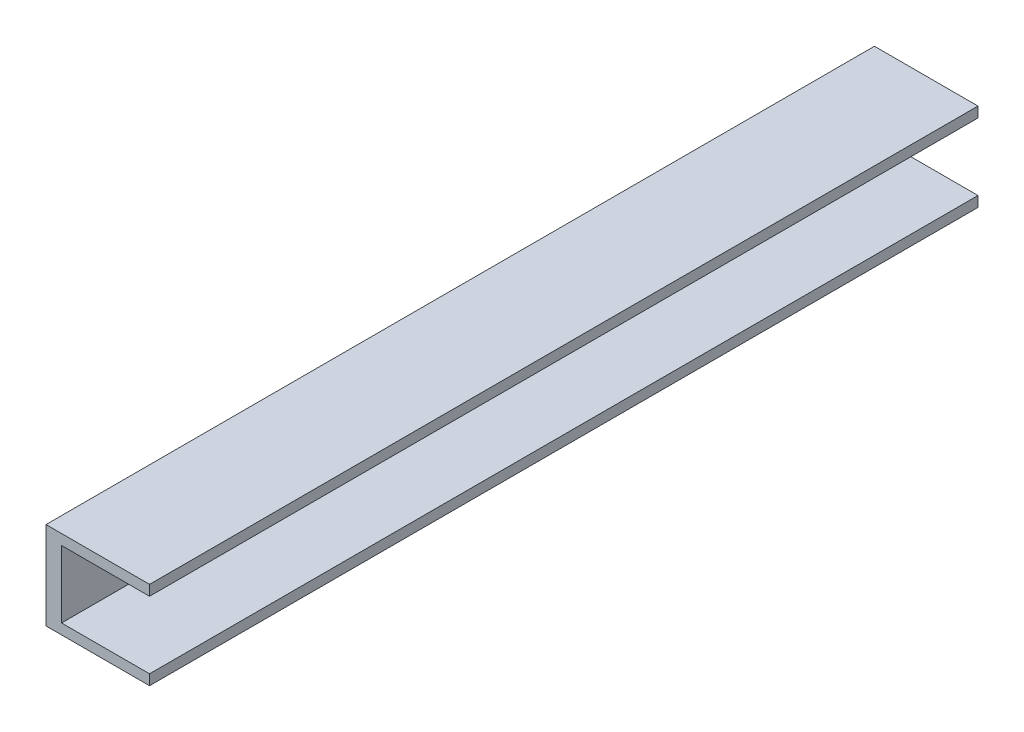
ISO-10303-21;
HEADER;
FILE_DESCRIPTION(('STEP AP214'),'2;1');
FILE_NAME('part.step','',(''),(''),'','','');
FILE_SCHEMA(('AUTOMOTIVE_DESIGN { 1 0 10303 214 1 1 1 1 }'));
ENDSEC;
DATA;
#1=APPLICATION_CONTEXT('core data for automotive mechanical design processes');
#2=APPLICATION_PROTOCOL_DEFINITION('international standard','automotive_design',2000,#1);
#3=PRODUCT_CONTEXT('',#1,'mechanical');
#4=PRODUCT('Part','Part','',(#3));
#5=PRODUCT_RELATED_PRODUCT_CATEGORY('part','',(#4));
#6=PRODUCT_DEFINITION_FORMATION('','',#4);
#7=PRODUCT_DEFINITION_CONTEXT('part definition',#1,'design');
#8=PRODUCT_DEFINITION('design','',#6,#7);
#9=PRODUCT_DEFINITION_SHAPE('','',#8);
#10=(LENGTH_UNIT() NAMED_UNIT(*) SI_UNIT(.MILLI.,.METRE.));
#11=(NAMED_UNIT(*) PLANE_ANGLE_UNIT() SI_UNIT($,.RADIAN.));
#12=(NAMED_UNIT(*) SI_UNIT($,.STERADIAN.) SOLID_ANGLE_UNIT());
#13=UNCERTAINTY_MEASURE_WITH_UNIT(LENGTH_MEASURE(1.E-05),#10,'distance_accuracy_value','');
#14=(GEOMETRIC_REPRESENTATION_CONTEXT(3) GLOBAL_UNCERTAINTY_ASSIGNED_CONTEXT((#13)) GLOBAL_UNIT_ASSIGNED_CONTEXT((#10,
#11,#12)) REPRESENTATION_CONTEXT('',''));
#15=CARTESIAN_POINT('',(0.,0.,0.));
#16=DIRECTION('',(0.,0.,1.));
#17=DIRECTION('',(1.,0.,0.));
#18=AXIS2_PLACEMENT_3D('',#15,#16,#17);
#19=CARTESIAN_POINT('',(31.75,0.,127.));
#20=DIRECTION('',(0.,1.,0.));
#21=DIRECTION('',(-1.,0.,0.));
#22=AXIS2_PLACEMENT_3D('',#19,#20,#21);
#23=PLANE('',#22);
#24=DIRECTION('',(1.,0.,0.));
#25=VECTOR('',#24,1.);
#26=CARTESIAN_POINT('',(31.75,0.,-127.));
#27=LINE('',#26,#25);
#28=CARTESIAN_POINT('',(0.,0.,-127.));
#29=VERTEX_POINT('',#28);
#30=CARTESIAN_POINT('',(31.75,0.,-127.));
#31=VERTEX_POINT('',#30);
#32=EDGE_CURVE('E140',#29,#31,#27,.T.);
#33=ORIENTED_EDGE('',*,*,#32,.T.);
#34=DIRECTION('',(0.,0.,-1.));
#35=VECTOR('',#34,1.);
#36=CARTESIAN_POINT('',(31.75,0.,127.));
#37=LINE('',#36,#35);
#38=CARTESIAN_POINT('',(31.75,0.,127.));
#39=VERTEX_POINT('',#38);
#40=EDGE_CURVE('E11',#39,#31,#37,.T.);
#41=ORIENTED_EDGE('',*,*,#40,.F.);
#42=DIRECTION('',(1.,0.,0.));
#43=VECTOR('',#42,1.);
#44=CARTESIAN_POINT('',(31.75,0.,127.));
#45=LINE('',#44,#43);
#46=CARTESIAN_POINT('',(0.,0.,127.));
#47=VERTEX_POINT('',#46);
#48=EDGE_CURVE('E158',#47,#39,#45,.T.);
#49=ORIENTED_EDGE('',*,*,#48,.F.);
#50=DIRECTION('',(0.,0.,-1.));
#51=VECTOR('',#50,1.);
#52=CARTESIAN_POINT('',(0.,0.,127.));
#53=LINE('',#52,#51);
#54=EDGE_CURVE('E136',#47,#29,#53,.T.);
#55=ORIENTED_EDGE('',*,*,#54,.T.);
#56=EDGE_LOOP('',(#33,#41,#49,#55));
#57=FACE_BOUND('',#56,.T.);
#58=ADVANCED_FACE('F32',(#57),#23,.F.);
#59=CARTESIAN_POINT('',(31.75,0.,127.));
#60=DIRECTION('',(-1.,0.,0.));
#61=DIRECTION('',(0.,0.,1.));
#62=AXIS2_PLACEMENT_3D('',#59,#60,#61);
#63=PLANE('',#62);
#64=DIRECTION('',(0.,1.,0.));
#65=VECTOR('',#64,1.);
#66=CARTESIAN_POINT('',(31.75,0.,-127.));
#67=LINE('',#66,#65);
#68=CARTESIAN_POINT('',(31.75,3.175,-127.));
#69=VERTEX_POINT('',#68);
#70=EDGE_CURVE('E143',#31,#69,#67,.T.);
#71=ORIENTED_EDGE('',*,*,#70,.T.);
#72=DIRECTION('',(0.,0.,-1.));
#73=VECTOR('',#72,1.);
#74=CARTESIAN_POINT('',(31.75,3.175,127.));
#75=LINE('',#74,#73);
#76=CARTESIAN_POINT('',(31.75,3.175,127.));
#77=VERTEX_POINT('',#76);
#78=EDGE_CURVE('E40',#77,#69,#75,.T.);
#79=ORIENTED_EDGE('',*,*,#78,.F.);
#80=DIRECTION('',(0.,1.,0.));
#81=VECTOR('',#80,1.);
#82=CARTESIAN_POINT('',(31.75,0.,127.));
#83=LINE('',#82,#81);
#84=EDGE_CURVE('E97',#39,#77,#83,.T.);
#85=ORIENTED_EDGE('',*,*,#84,.F.);
#86=ORIENTED_EDGE('',*,*,#40,.T.);
#87=EDGE_LOOP('',(#71,#79,#85,#86));
#88=FACE_BOUND('',#87,.T.);
#89=ADVANCED_FACE('F207',(#88),#63,.F.);
#90=CARTESIAN_POINT('',(4.76504000000001,3.17499999999999,127.));
#91=DIRECTION('',(0.,-1.,0.));
#92=DIRECTION('',(1.,0.,0.));
#93=AXIS2_PLACEMENT_3D('',#90,#91,#92);
#94=PLANE('',#93);
#95=DIRECTION('',(-1.,0.,0.));
#96=VECTOR('',#95,1.);
#97=CARTESIAN_POINT('',(4.76504000000001,3.17499999999999,-127.));
#98=LINE('',#97,#96);
#99=CARTESIAN_POINT('',(4.76504000000001,3.17499999999999,-127.));
#100=VERTEX_POINT('',#99);
#101=EDGE_CURVE('E145',#69,#100,#98,.T.);
#102=ORIENTED_EDGE('',*,*,#101,.T.);
#103=DIRECTION('',(0.,0.,-1.));
#104=VECTOR('',#103,1.);
#105=CARTESIAN_POINT('',(4.76504000000001,3.17499999999999,127.));
#106=LINE('',#105,#104);
#107=CARTESIAN_POINT('',(4.76504000000001,3.17499999999999,127.));
#108=VERTEX_POINT('',#107);
#109=EDGE_CURVE('E171',#108,#100,#106,.T.);
#110=ORIENTED_EDGE('',*,*,#109,.F.);
#111=DIRECTION('',(-1.,0.,0.));
#112=VECTOR('',#111,1.);
#113=CARTESIAN_POINT('',(4.76504000000001,3.17499999999999,127.));
#114=LINE('',#113,#112);
#115=EDGE_CURVE('E179',#77,#108,#114,.T.);
#116=ORIENTED_EDGE('',*,*,#115,.F.);
#117=ORIENTED_EDGE('',*,*,#78,.T.);
#118=EDGE_LOOP('',(#102,#110,#116,#117));
#119=FACE_BOUND('',#118,.T.);
#120=ADVANCED_FACE('F177',(#119),#94,.F.);
#121=CARTESIAN_POINT('',(4.76504000000001,3.17753999999999,127.));
#122=DIRECTION('',(0.,0.,-1.));
#123=DIRECTION('',(-1.,0.,0.));
#124=AXIS2_PLACEMENT_3D('',#121,#122,#123);
#125=CYLINDRICAL_SURFACE('',#124,0.00253999999999944);
#126=CARTESIAN_POINT('',(4.76504000000001,3.17753999999999,-127.));
#127=DIRECTION('',(0.,0.,-1.));
#128=DIRECTION('',(-1.,0.,0.));
#129=AXIS2_PLACEMENT_3D('',#126,#127,#128);
#130=CIRCLE('',#129,0.00253999999999944);
#131=CARTESIAN_POINT('',(4.76250000000001,3.17753999999999,-127.));
#132=VERTEX_POINT('',#131);
#133=EDGE_CURVE('E147',#100,#132,#130,.T.);
#134=ORIENTED_EDGE('',*,*,#133,.T.);
#135=DIRECTION('',(0.,0.,-1.));
#136=VECTOR('',#135,1.);
#137=CARTESIAN_POINT('',(4.76250000000001,3.17753999999999,127.));
#138=LINE('',#137,#136);
#139=CARTESIAN_POINT('',(4.76250000000001,3.17753999999999,127.));
#140=VERTEX_POINT('',#139);
#141=EDGE_CURVE('E168',#140,#132,#138,.T.);
#142=ORIENTED_EDGE('',*,*,#141,.F.);
#143=CARTESIAN_POINT('',(4.76504000000001,3.17753999999999,127.));
#144=DIRECTION('',(0.,0.,-1.));
#145=DIRECTION('',(-1.,0.,0.));
#146=AXIS2_PLACEMENT_3D('',#143,#144,#145);
#147=CIRCLE('',#146,0.00253999999999944);
#148=EDGE_CURVE('E197',#108,#140,#147,.T.);
#149=ORIENTED_EDGE('',*,*,#148,.F.);
#150=ORIENTED_EDGE('',*,*,#109,.T.);
#151=EDGE_LOOP('',(#134,#142,#149,#150));
#152=FACE_BOUND('',#151,.T.);
#153=ADVANCED_FACE('F188',(#152),#125,.F.);
#154=CARTESIAN_POINT('',(4.76250000000001,23.74646,127.));
#155=DIRECTION('',(-1.,0.,0.));
#156=DIRECTION('',(0.,-1.,0.));
#157=AXIS2_PLACEMENT_3D('',#154,#155,#156);
#158=PLANE('',#157);
#159=DIRECTION('',(0.,1.,0.));
#160=VECTOR('',#159,1.);
#161=CARTESIAN_POINT('',(4.76250000000001,23.74646,-127.));
#162=LINE('',#161,#160);
#163=CARTESIAN_POINT('',(4.76250000000001,23.74646,-127.));
#164=VERTEX_POINT('',#163);
#165=EDGE_CURVE('E149',#132,#164,#162,.T.);
#166=ORIENTED_EDGE('',*,*,#165,.T.);
#167=DIRECTION('',(0.,0.,-1.));
#168=VECTOR('',#167,1.);
#169=CARTESIAN_POINT('',(4.76250000000001,23.74646,127.));
#170=LINE('',#169,#168);
#171=CARTESIAN_POINT('',(4.76250000000001,23.74646,127.));
#172=VERTEX_POINT('',#171);
#173=EDGE_CURVE('E165',#172,#164,#170,.T.);
#174=ORIENTED_EDGE('',*,*,#173,.F.);
#175=DIRECTION('',(0.,1.,0.));
#176=VECTOR('',#175,1.);
#177=CARTESIAN_POINT('',(4.76250000000001,23.74646,127.));
#178=LINE('',#177,#176);
#179=EDGE_CURVE('E194',#140,#172,#178,.T.);
#180=ORIENTED_EDGE('',*,*,#179,.F.);
#181=ORIENTED_EDGE('',*,*,#141,.T.);
#182=EDGE_LOOP('',(#166,#174,#180,#181));
#183=FACE_BOUND('',#182,.T.);
#184=ADVANCED_FACE('F192',(#183),#158,.F.);
#185=CARTESIAN_POINT('',(4.76504000000001,23.74646,127.));
#186=DIRECTION('',(0.,0.,-1.));
#187=DIRECTION('',(-1.,0.,0.));
#188=AXIS2_PLACEMENT_3D('',#185,#186,#187);
#189=CYLINDRICAL_SURFACE('',#188,0.00253999999999749);
#190=CARTESIAN_POINT('',(4.76504000000001,23.74646,-127.));
#191=DIRECTION('',(0.,0.,-1.));
#192=DIRECTION('',(-1.,0.,0.));
#193=AXIS2_PLACEMENT_3D('',#190,#191,#192);
#194=CIRCLE('',#193,0.00253999999999749);
#195=CARTESIAN_POINT('',(4.76504000000001,23.749,-127.));
#196=VERTEX_POINT('',#195);
#197=EDGE_CURVE('E151',#164,#196,#194,.T.);
#198=ORIENTED_EDGE('',*,*,#197,.T.);
#199=DIRECTION('',(0.,0.,-1.));
#200=VECTOR('',#199,1.);
#201=CARTESIAN_POINT('',(4.76504000000001,23.749,127.));
#202=LINE('',#201,#200);
#203=CARTESIAN_POINT('',(4.76504000000001,23.749,127.));
#204=VERTEX_POINT('',#203);
#205=EDGE_CURVE('E162',#204,#196,#202,.T.);
#206=ORIENTED_EDGE('',*,*,#205,.F.);
#207=CARTESIAN_POINT('',(4.76504000000001,23.74646,127.));
#208=DIRECTION('',(0.,0.,-1.));
#209=DIRECTION('',(-1.,0.,0.));
#210=AXIS2_PLACEMENT_3D('',#207,#208,#209);
#211=CIRCLE('',#210,0.00253999999999749);
#212=EDGE_CURVE('E196',#172,#204,#211,.T.);
#213=ORIENTED_EDGE('',*,*,#212,.F.);
#214=ORIENTED_EDGE('',*,*,#173,.T.);
#215=EDGE_LOOP('',(#198,#206,#213,#214));
#216=FACE_BOUND('',#215,.T.);
#217=ADVANCED_FACE('F219',(#216),#189,.F.);
#218=CARTESIAN_POINT('',(4.76504000000001,23.749,127.));
#219=DIRECTION('',(0.,1.,0.));
#220=DIRECTION('',(0.,0.,1.));
#221=AXIS2_PLACEMENT_3D('',#218,#219,#220);
#222=PLANE('',#221);
#223=DIRECTION('',(1.,0.,0.));
#224=VECTOR('',#223,1.);
#225=CARTESIAN_POINT('',(4.76504000000001,23.749,-127.));
#226=LINE('',#225,#224);
#227=CARTESIAN_POINT('',(31.75,23.749,-127.));
#228=VERTEX_POINT('',#227);
#229=EDGE_CURVE('E153',#196,#228,#226,.T.);
#230=ORIENTED_EDGE('',*,*,#229,.T.);
#231=DIRECTION('',(0.,0.,-1.));
#232=VECTOR('',#231,1.);
#233=CARTESIAN_POINT('',(31.75,23.749,127.));
#234=LINE('',#233,#232);
#235=CARTESIAN_POINT('',(31.75,23.749,127.));
#236=VERTEX_POINT('',#235);
#237=EDGE_CURVE('E131',#236,#228,#234,.T.);
#238=ORIENTED_EDGE('',*,*,#237,.F.);
#239=DIRECTION('',(1.,0.,0.));
#240=VECTOR('',#239,1.);
#241=CARTESIAN_POINT('',(4.76504000000001,23.749,127.));
#242=LINE('',#241,#240);
#243=EDGE_CURVE('E122',#204,#236,#242,.T.);
#244=ORIENTED_EDGE('',*,*,#243,.F.);
#245=ORIENTED_EDGE('',*,*,#205,.T.);
#246=EDGE_LOOP('',(#230,#238,#244,#245));
#247=FACE_BOUND('',#246,.T.);
#248=ADVANCED_FACE('F222',(#247),#222,.F.);
#249=CARTESIAN_POINT('',(31.75,26.924,127.));
#250=DIRECTION('',(-1.,0.,0.));
#251=DIRECTION('',(0.,-1.,0.));
#252=AXIS2_PLACEMENT_3D('',#249,#250,#251);
#253=PLANE('',#252);
#254=DIRECTION('',(0.,1.,0.));
#255=VECTOR('',#254,1.);
#256=CARTESIAN_POINT('',(31.75,26.924,-127.));
#257=LINE('',#256,#255);
#258=CARTESIAN_POINT('',(31.75,26.924,-127.));
#259=VERTEX_POINT('',#258);
#260=EDGE_CURVE('E130',#228,#259,#257,.T.);
#261=ORIENTED_EDGE('',*,*,#260,.T.);
#262=DIRECTION('',(0.,0.,-1.));
#263=VECTOR('',#262,1.);
#264=CARTESIAN_POINT('',(31.75,26.924,127.));
#265=LINE('',#264,#263);
#266=CARTESIAN_POINT('',(31.75,26.924,127.));
#267=VERTEX_POINT('',#266);
#268=EDGE_CURVE('E127',#267,#259,#265,.T.);
#269=ORIENTED_EDGE('',*,*,#268,.F.);
#270=DIRECTION('',(0.,1.,0.));
#271=VECTOR('',#270,1.);
#272=CARTESIAN_POINT('',(31.75,26.924,127.));
#273=LINE('',#272,#271);
#274=EDGE_CURVE('E116',#236,#267,#273,.T.);
#275=ORIENTED_EDGE('',*,*,#274,.F.);
#276=ORIENTED_EDGE('',*,*,#237,.T.);
#277=EDGE_LOOP('',(#261,#269,#275,#276));
#278=FACE_BOUND('',#277,.T.);
#279=ADVANCED_FACE('F128',(#278),#253,.F.);
#280=CARTESIAN_POINT('',(31.75,26.924,127.));
#281=DIRECTION('',(0.,-1.,0.));
#282=DIRECTION('',(1.,0.,0.));
#283=AXIS2_PLACEMENT_3D('',#280,#281,#282);
#284=PLANE('',#283);
#285=DIRECTION('',(-1.,0.,0.));
#286=VECTOR('',#285,1.);
#287=CARTESIAN_POINT('',(31.75,26.924,-127.));
#288=LINE('',#287,#286);
#289=CARTESIAN_POINT('',(0.,26.924,-127.));
#290=VERTEX_POINT('',#289);
#291=EDGE_CURVE('E83',#259,#290,#288,.T.);
#292=ORIENTED_EDGE('',*,*,#291,.T.);
#293=DIRECTION('',(0.,0.,-1.));
#294=VECTOR('',#293,1.);
#295=CARTESIAN_POINT('',(0.,26.924,127.));
#296=LINE('',#295,#294);
#297=CARTESIAN_POINT('',(0.,26.924,127.));
#298=VERTEX_POINT('',#297);
#299=EDGE_CURVE('E132',#298,#290,#296,.T.);
#300=ORIENTED_EDGE('',*,*,#299,.F.);
#301=DIRECTION('',(-1.,0.,0.));
#302=VECTOR('',#301,1.);
#303=CARTESIAN_POINT('',(31.75,26.924,127.));
#304=LINE('',#303,#302);
#305=EDGE_CURVE('E120',#267,#298,#304,.T.);
#306=ORIENTED_EDGE('',*,*,#305,.F.);
#307=ORIENTED_EDGE('',*,*,#268,.T.);
#308=EDGE_LOOP('',(#292,#300,#306,#307));
#309=FACE_BOUND('',#308,.T.);
#310=ADVANCED_FACE('F134',(#309),#284,.F.);
#311=CARTESIAN_POINT('',(0.,0.,127.));
#312=DIRECTION('',(1.,0.,0.));
#313=DIRECTION('',(0.,0.,-1.));
#314=AXIS2_PLACEMENT_3D('',#311,#312,#313);
#315=PLANE('',#314);
#316=DIRECTION('',(0.,-1.,0.));
#317=VECTOR('',#316,1.);
#318=CARTESIAN_POINT('',(0.,0.,-127.));
#319=LINE('',#318,#317);
#320=EDGE_CURVE('E89',#290,#29,#319,.T.);
#321=ORIENTED_EDGE('',*,*,#320,.T.);
#322=ORIENTED_EDGE('',*,*,#54,.F.);
#323=DIRECTION('',(0.,-1.,0.));
#324=VECTOR('',#323,1.);
#325=CARTESIAN_POINT('',(0.,0.,127.));
#326=LINE('',#325,#324);
#327=EDGE_CURVE('E48',#298,#47,#326,.T.);
#328=ORIENTED_EDGE('',*,*,#327,.F.);
#329=ORIENTED_EDGE('',*,*,#299,.T.);
#330=EDGE_LOOP('',(#321,#322,#328,#329));
#331=FACE_BOUND('',#330,.T.);
#332=ADVANCED_FACE('F231',(#331),#315,.F.);
#333=CARTESIAN_POINT('',(4.76504000000001,23.74646,127.));
#334=DIRECTION('',(0.,0.,-1.));
#335=DIRECTION('',(-1.,0.,0.));
#336=AXIS2_PLACEMENT_3D('',#333,#334,#335);
#337=PLANE('',#336);
#338=ORIENTED_EDGE('',*,*,#48,.T.);
#339=ORIENTED_EDGE('',*,*,#84,.T.);
#340=ORIENTED_EDGE('',*,*,#115,.T.);
#341=ORIENTED_EDGE('',*,*,#148,.T.);
#342=ORIENTED_EDGE('',*,*,#179,.T.);
#343=ORIENTED_EDGE('',*,*,#212,.T.);
#344=ORIENTED_EDGE('',*,*,#243,.T.);
#345=ORIENTED_EDGE('',*,*,#274,.T.);
#346=ORIENTED_EDGE('',*,*,#305,.T.);
#347=ORIENTED_EDGE('',*,*,#327,.T.);
#348=EDGE_LOOP('',(#338,#339,#340,#341,#342,#343,#344,#345,#346,#347));
#349=FACE_BOUND('',#348,.T.);
#350=ADVANCED_FACE('F118',(#349),#337,.F.);
#351=CARTESIAN_POINT('',(4.76504000000001,23.74646,-127.));
#352=DIRECTION('',(0.,0.,-1.));
#353=DIRECTION('',(-1.,0.,0.));
#354=AXIS2_PLACEMENT_3D('',#351,#352,#353);
#355=PLANE('',#354);
#356=ORIENTED_EDGE('',*,*,#32,.F.);
#357=ORIENTED_EDGE('',*,*,#320,.F.);
#358=ORIENTED_EDGE('',*,*,#291,.F.);
#359=ORIENTED_EDGE('',*,*,#260,.F.);
#360=ORIENTED_EDGE('',*,*,#229,.F.);
#361=ORIENTED_EDGE('',*,*,#197,.F.);
#362=ORIENTED_EDGE('',*,*,#165,.F.);
#363=ORIENTED_EDGE('',*,*,#133,.F.);
#364=ORIENTED_EDGE('',*,*,#101,.F.);
#365=ORIENTED_EDGE('',*,*,#70,.F.);
#366=EDGE_LOOP('',(#356,#357,#358,#359,#360,#361,#362,#363,#364,#365));
#367=FACE_BOUND('',#366,.T.);
#368=ADVANCED_FACE('F183',(#367),#355,.T.);
#369=CLOSED_SHELL('',(#58,#89,#120,#153,#184,#217,#248,#279,#310,#332,#350,#368));
#370=MANIFOLD_SOLID_BREP('B2',#369);
#371=ADVANCED_BREP_SHAPE_REPRESENTATION('',(#18,#370),#14);
#372=SHAPE_DEFINITION_REPRESENTATION(#9,#371);
ENDSEC;
END-ISO-10303-21;
